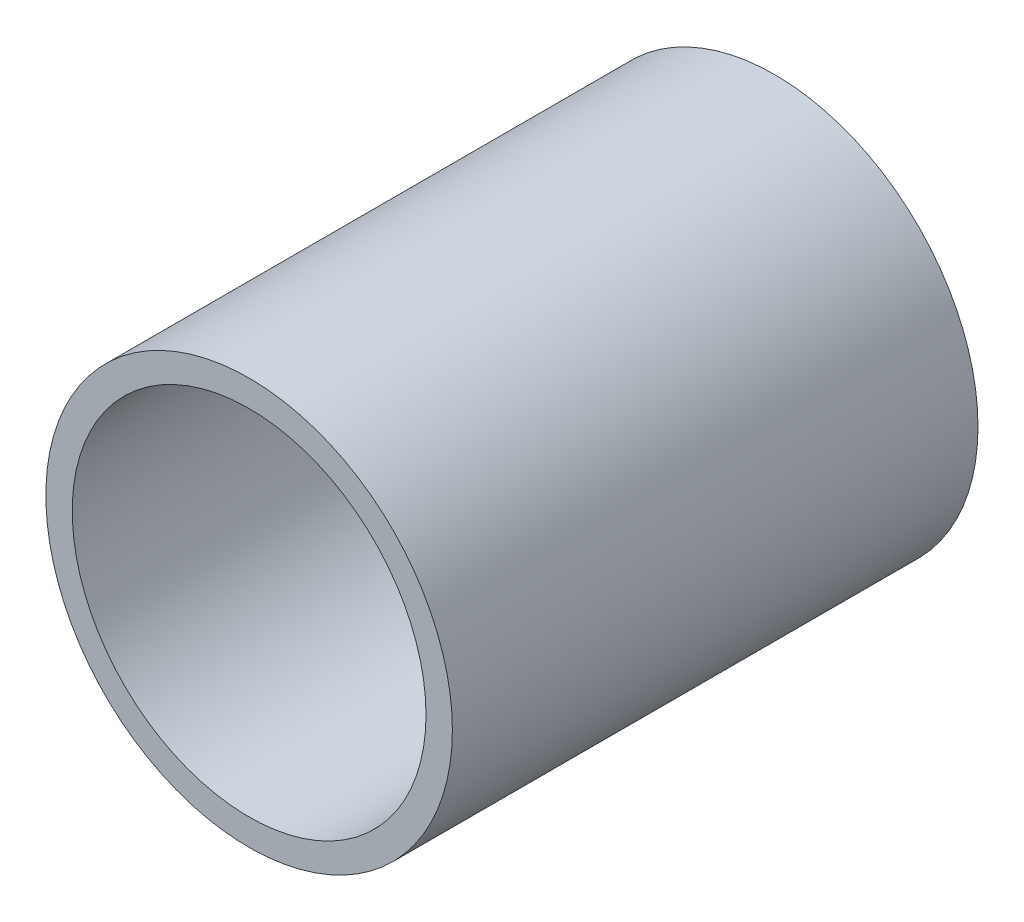
ISO-10303-21;
HEADER;
FILE_DESCRIPTION(('STEP AP214'),'2;1');
FILE_NAME('part.step','',(''),(''),'','','');
FILE_SCHEMA(('AUTOMOTIVE_DESIGN { 1 0 10303 214 1 1 1 1 }'));
ENDSEC;
DATA;
#1=APPLICATION_CONTEXT('core data for automotive mechanical design processes');
#2=APPLICATION_PROTOCOL_DEFINITION('international standard','automotive_design',2000,#1);
#3=PRODUCT_CONTEXT('',#1,'mechanical');
#4=PRODUCT('Part','Part','',(#3));
#5=PRODUCT_RELATED_PRODUCT_CATEGORY('part','',(#4));
#6=PRODUCT_DEFINITION_FORMATION('','',#4);
#7=PRODUCT_DEFINITION_CONTEXT('part definition',#1,'design');
#8=PRODUCT_DEFINITION('design','',#6,#7);
#9=PRODUCT_DEFINITION_SHAPE('','',#8);
#10=(LENGTH_UNIT() NAMED_UNIT(*) SI_UNIT(.MILLI.,.METRE.));
#11=(NAMED_UNIT(*) PLANE_ANGLE_UNIT() SI_UNIT($,.RADIAN.));
#12=(NAMED_UNIT(*) SI_UNIT($,.STERADIAN.) SOLID_ANGLE_UNIT());
#13=UNCERTAINTY_MEASURE_WITH_UNIT(LENGTH_MEASURE(1.E-05),#10,'distance_accuracy_value','');
#14=(GEOMETRIC_REPRESENTATION_CONTEXT(3) GLOBAL_UNCERTAINTY_ASSIGNED_CONTEXT((#13)) GLOBAL_UNIT_ASSIGNED_CONTEXT((#10,
#11,#12)) REPRESENTATION_CONTEXT('',''));
#15=CARTESIAN_POINT('',(0.,0.,0.));
#16=DIRECTION('',(0.,0.,1.));
#17=DIRECTION('',(1.,0.,0.));
#18=AXIS2_PLACEMENT_3D('',#15,#16,#17);
#19=CARTESIAN_POINT('',(0.,0.,39.));
#20=DIRECTION('',(0.,0.,1.));
#21=DIRECTION('',(1.,0.,0.));
#22=AXIS2_PLACEMENT_3D('',#19,#20,#21);
#23=PLANE('',#22);
#24=CARTESIAN_POINT('',(0.,0.,39.));
#25=DIRECTION('',(0.,0.,1.));
#26=DIRECTION('',(1.,0.,0.));
#27=AXIS2_PLACEMENT_3D('',#24,#25,#26);
#28=CIRCLE('',#27,30.1625);
#29=CARTESIAN_POINT('',(30.1625,0.,39.));
#30=VERTEX_POINT('',#29);
#31=EDGE_CURVE('E11',#30,#30,#28,.T.);
#32=ORIENTED_EDGE('',*,*,#31,.T.);
#33=EDGE_LOOP('',(#32));
#34=FACE_BOUND('',#33,.T.);
#35=CARTESIAN_POINT('',(0.,0.,39.));
#36=DIRECTION('',(0.,0.,1.));
#37=DIRECTION('',(1.,0.,0.));
#38=AXIS2_PLACEMENT_3D('',#35,#36,#37);
#39=CIRCLE('',#38,26.2509);
#40=CARTESIAN_POINT('',(26.2509,0.,39.));
#41=VERTEX_POINT('',#40);
#42=EDGE_CURVE('E56',#41,#41,#39,.T.);
#43=ORIENTED_EDGE('',*,*,#42,.F.);
#44=EDGE_LOOP('',(#43));
#45=FACE_BOUND('',#44,.T.);
#46=ADVANCED_FACE('F43',(#34,#45),#23,.T.);
#47=CARTESIAN_POINT('',(0.,0.,-39.));
#48=DIRECTION('',(0.,0.,1.));
#49=DIRECTION('',(1.,0.,0.));
#50=AXIS2_PLACEMENT_3D('',#47,#48,#49);
#51=PLANE('',#50);
#52=CARTESIAN_POINT('',(0.,0.,-39.));
#53=DIRECTION('',(0.,0.,1.));
#54=DIRECTION('',(1.,0.,0.));
#55=AXIS2_PLACEMENT_3D('',#52,#53,#54);
#56=CIRCLE('',#55,30.1625);
#57=CARTESIAN_POINT('',(30.1625,0.,-39.));
#58=VERTEX_POINT('',#57);
#59=EDGE_CURVE('E47',#58,#58,#56,.T.);
#60=ORIENTED_EDGE('',*,*,#59,.F.);
#61=EDGE_LOOP('',(#60));
#62=FACE_BOUND('',#61,.T.);
#63=CARTESIAN_POINT('',(0.,0.,-39.));
#64=DIRECTION('',(0.,0.,1.));
#65=DIRECTION('',(1.,0.,0.));
#66=AXIS2_PLACEMENT_3D('',#63,#64,#65);
#67=CIRCLE('',#66,26.2509);
#68=CARTESIAN_POINT('',(26.2509,0.,-39.));
#69=VERTEX_POINT('',#68);
#70=EDGE_CURVE('E58',#69,#69,#67,.T.);
#71=ORIENTED_EDGE('',*,*,#70,.T.);
#72=EDGE_LOOP('',(#71));
#73=FACE_BOUND('',#72,.T.);
#74=ADVANCED_FACE('F70',(#62,#73),#51,.F.);
#75=CARTESIAN_POINT('',(0.,0.,39.));
#76=DIRECTION('',(0.,0.,-1.));
#77=DIRECTION('',(-1.,0.,0.));
#78=AXIS2_PLACEMENT_3D('',#75,#76,#77);
#79=CYLINDRICAL_SURFACE('',#78,30.1625);
#80=ORIENTED_EDGE('',*,*,#31,.F.);
#81=EDGE_LOOP('',(#80));
#82=FACE_BOUND('',#81,.T.);
#83=ORIENTED_EDGE('',*,*,#59,.T.);
#84=EDGE_LOOP('',(#83));
#85=FACE_BOUND('',#84,.T.);
#86=ADVANCED_FACE('F45',(#82,#85),#79,.T.);
#87=CARTESIAN_POINT('',(0.,0.,39.));
#88=DIRECTION('',(0.,0.,-1.));
#89=DIRECTION('',(-1.,0.,0.));
#90=AXIS2_PLACEMENT_3D('',#87,#88,#89);
#91=CYLINDRICAL_SURFACE('',#90,26.2509);
#92=ORIENTED_EDGE('',*,*,#42,.T.);
#93=EDGE_LOOP('',(#92));
#94=FACE_BOUND('',#93,.T.);
#95=ORIENTED_EDGE('',*,*,#70,.F.);
#96=EDGE_LOOP('',(#95));
#97=FACE_BOUND('',#96,.T.);
#98=ADVANCED_FACE('F66',(#94,#97),#91,.F.);
#99=CLOSED_SHELL('',(#46,#74,#86,#98));
#100=MANIFOLD_SOLID_BREP('B2',#99);
#101=ADVANCED_BREP_SHAPE_REPRESENTATION('',(#18,#100),#14);
#102=SHAPE_DEFINITION_REPRESENTATION(#9,#101);
ENDSEC;
END-ISO-10303-21;
